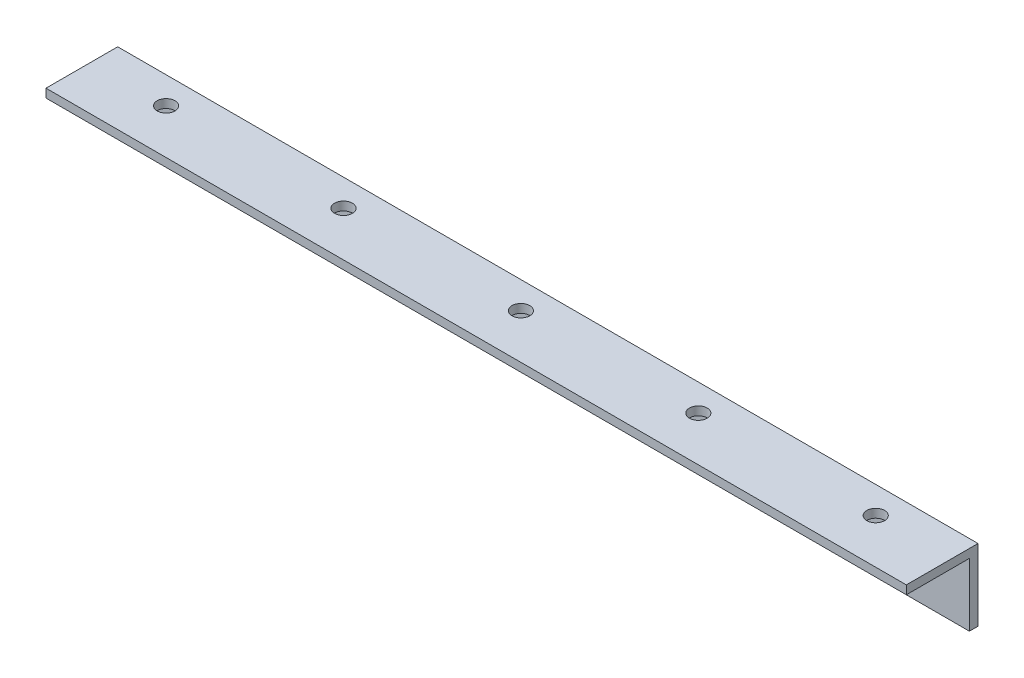
ISO-10303-21;
HEADER;
FILE_DESCRIPTION(('STEP AP214'),'2;1');
FILE_NAME('part.step','',(''),(''),'','','');
FILE_SCHEMA(('AUTOMOTIVE_DESIGN { 1 0 10303 214 1 1 1 1 }'));
ENDSEC;
DATA;
#1=APPLICATION_CONTEXT('core data for automotive mechanical design processes');
#2=APPLICATION_PROTOCOL_DEFINITION('international standard','automotive_design',2000,#1);
#3=PRODUCT_CONTEXT('',#1,'mechanical');
#4=PRODUCT('Part','Part','',(#3));
#5=PRODUCT_RELATED_PRODUCT_CATEGORY('part','',(#4));
#6=PRODUCT_DEFINITION_FORMATION('','',#4);
#7=PRODUCT_DEFINITION_CONTEXT('part definition',#1,'design');
#8=PRODUCT_DEFINITION('design','',#6,#7);
#9=PRODUCT_DEFINITION_SHAPE('','',#8);
#10=(LENGTH_UNIT() NAMED_UNIT(*) SI_UNIT(.MILLI.,.METRE.));
#11=(NAMED_UNIT(*) PLANE_ANGLE_UNIT() SI_UNIT($,.RADIAN.));
#12=(NAMED_UNIT(*) SI_UNIT($,.STERADIAN.) SOLID_ANGLE_UNIT());
#13=UNCERTAINTY_MEASURE_WITH_UNIT(LENGTH_MEASURE(1.E-05),#10,'distance_accuracy_value','');
#14=(GEOMETRIC_REPRESENTATION_CONTEXT(3) GLOBAL_UNCERTAINTY_ASSIGNED_CONTEXT((#13)) GLOBAL_UNIT_ASSIGNED_CONTEXT((#10,
#11,#12)) REPRESENTATION_CONTEXT('',''));
#15=CARTESIAN_POINT('',(0.,0.,0.));
#16=DIRECTION('',(0.,0.,1.));
#17=DIRECTION('',(1.,0.,0.));
#18=AXIS2_PLACEMENT_3D('',#15,#16,#17);
#19=CARTESIAN_POINT('',(-150.,42.,-225.));
#20=DIRECTION('',(1.,0.,0.));
#21=DIRECTION('',(0.,0.,-1.));
#22=AXIS2_PLACEMENT_3D('',#19,#20,#21);
#23=PLANE('',#22);
#24=DIRECTION('',(0.,0.,-1.));
#25=VECTOR('',#24,1.);
#26=CARTESIAN_POINT('',(-150.,45.,-225.));
#27=LINE('',#26,#25);
#28=CARTESIAN_POINT('',(-150.,45.,-195.));
#29=VERTEX_POINT('',#28);
#30=CARTESIAN_POINT('',(-150.,45.,-220.));
#31=VERTEX_POINT('',#30);
#32=EDGE_CURVE('E99',#29,#31,#27,.T.);
#33=ORIENTED_EDGE('',*,*,#32,.T.);
#34=DIRECTION('',(0.,-1.,0.));
#35=VECTOR('',#34,1.);
#36=CARTESIAN_POINT('',(-150.,50.,-220.));
#37=LINE('',#36,#35);
#38=CARTESIAN_POINT('',(-150.,20.,-220.));
#39=VERTEX_POINT('',#38);
#40=EDGE_CURVE('E102',#31,#39,#37,.T.);
#41=ORIENTED_EDGE('',*,*,#40,.T.);
#42=DIRECTION('',(0.,0.,-1.));
#43=VECTOR('',#42,1.);
#44=CARTESIAN_POINT('',(-150.,20.,-217.));
#45=LINE('',#44,#43);
#46=CARTESIAN_POINT('',(-150.,20.,-217.));
#47=VERTEX_POINT('',#46);
#48=EDGE_CURVE('E138',#47,#39,#45,.T.);
#49=ORIENTED_EDGE('',*,*,#48,.F.);
#50=DIRECTION('',(0.,-1.,0.));
#51=VECTOR('',#50,1.);
#52=CARTESIAN_POINT('',(-150.,50.,-217.));
#53=LINE('',#52,#51);
#54=CARTESIAN_POINT('',(-150.,42.,-217.));
#55=VERTEX_POINT('',#54);
#56=EDGE_CURVE('E133',#55,#47,#53,.T.);
#57=ORIENTED_EDGE('',*,*,#56,.F.);
#58=DIRECTION('',(0.,0.,-1.));
#59=VECTOR('',#58,1.);
#60=CARTESIAN_POINT('',(-150.,42.,-225.));
#61=LINE('',#60,#59);
#62=CARTESIAN_POINT('',(-150.,42.,-195.));
#63=VERTEX_POINT('',#62);
#64=EDGE_CURVE('E67',#63,#55,#61,.T.);
#65=ORIENTED_EDGE('',*,*,#64,.F.);
#66=DIRECTION('',(0.,1.,0.));
#67=VECTOR('',#66,1.);
#68=CARTESIAN_POINT('',(-150.,42.,-195.));
#69=LINE('',#68,#67);
#70=EDGE_CURVE('E105',#63,#29,#69,.T.);
#71=ORIENTED_EDGE('',*,*,#70,.T.);
#72=EDGE_LOOP('',(#33,#41,#49,#57,#65,#71));
#73=FACE_BOUND('',#72,.T.);
#74=ADVANCED_FACE('F45',(#73),#23,.F.);
#75=CARTESIAN_POINT('',(150.,42.,-225.));
#76=DIRECTION('',(-1.,0.,0.));
#77=DIRECTION('',(0.,0.,1.));
#78=AXIS2_PLACEMENT_3D('',#75,#76,#77);
#79=PLANE('',#78);
#80=DIRECTION('',(0.,1.,0.));
#81=VECTOR('',#80,1.);
#82=CARTESIAN_POINT('',(150.,50.,-220.));
#83=LINE('',#82,#81);
#84=CARTESIAN_POINT('',(150.,20.,-220.));
#85=VERTEX_POINT('',#84);
#86=CARTESIAN_POINT('',(150.,45.,-220.));
#87=VERTEX_POINT('',#86);
#88=EDGE_CURVE('E122',#85,#87,#83,.T.);
#89=ORIENTED_EDGE('',*,*,#88,.T.);
#90=DIRECTION('',(0.,0.,1.));
#91=VECTOR('',#90,1.);
#92=CARTESIAN_POINT('',(150.,45.,-225.));
#93=LINE('',#92,#91);
#94=CARTESIAN_POINT('',(150.,45.,-195.));
#95=VERTEX_POINT('',#94);
#96=EDGE_CURVE('E59',#87,#95,#93,.T.);
#97=ORIENTED_EDGE('',*,*,#96,.T.);
#98=DIRECTION('',(0.,1.,0.));
#99=VECTOR('',#98,1.);
#100=CARTESIAN_POINT('',(150.,42.,-195.));
#101=LINE('',#100,#99);
#102=CARTESIAN_POINT('',(150.,42.,-195.));
#103=VERTEX_POINT('',#102);
#104=EDGE_CURVE('E53',#103,#95,#101,.T.);
#105=ORIENTED_EDGE('',*,*,#104,.F.);
#106=DIRECTION('',(0.,0.,1.));
#107=VECTOR('',#106,1.);
#108=CARTESIAN_POINT('',(150.,42.,-225.));
#109=LINE('',#108,#107);
#110=CARTESIAN_POINT('',(150.,42.,-217.));
#111=VERTEX_POINT('',#110);
#112=EDGE_CURVE('E185',#111,#103,#109,.T.);
#113=ORIENTED_EDGE('',*,*,#112,.F.);
#114=DIRECTION('',(0.,1.,0.));
#115=VECTOR('',#114,1.);
#116=CARTESIAN_POINT('',(150.,50.,-217.));
#117=LINE('',#116,#115);
#118=CARTESIAN_POINT('',(150.,20.,-217.));
#119=VERTEX_POINT('',#118);
#120=EDGE_CURVE('E128',#119,#111,#117,.T.);
#121=ORIENTED_EDGE('',*,*,#120,.F.);
#122=DIRECTION('',(0.,0.,-1.));
#123=VECTOR('',#122,1.);
#124=CARTESIAN_POINT('',(150.,20.,-217.));
#125=LINE('',#124,#123);
#126=EDGE_CURVE('E134',#119,#85,#125,.T.);
#127=ORIENTED_EDGE('',*,*,#126,.T.);
#128=EDGE_LOOP('',(#89,#97,#105,#113,#121,#127));
#129=FACE_BOUND('',#128,.T.);
#130=ADVANCED_FACE('F204',(#129),#79,.F.);
#131=CARTESIAN_POINT('',(0.,0.,-220.));
#132=DIRECTION('',(0.,0.,1.));
#133=DIRECTION('',(1.,0.,0.));
#134=AXIS2_PLACEMENT_3D('',#131,#132,#133);
#135=PLANE('',#134);
#136=CARTESIAN_POINT('',(-123.733333333333,35.6000000000007,-220.));
#137=DIRECTION('',(0.,0.,1.));
#138=DIRECTION('',(1.,0.,0.));
#139=AXIS2_PLACEMENT_3D('',#136,#137,#138);
#140=CIRCLE('',#139,3.09999999999999);
#141=CARTESIAN_POINT('',(-120.633333333333,35.6000000000007,-220.));
#142=VERTEX_POINT('',#141);
#143=EDGE_CURVE('E246',#142,#142,#140,.T.);
#144=ORIENTED_EDGE('',*,*,#143,.T.);
#145=EDGE_LOOP('',(#144));
#146=FACE_BOUND('',#145,.T.);
#147=CARTESIAN_POINT('',(-61.8666666666666,35.6000000000015,-220.));
#148=DIRECTION('',(0.,0.,1.));
#149=DIRECTION('',(1.,0.,0.));
#150=AXIS2_PLACEMENT_3D('',#147,#148,#149);
#151=CIRCLE('',#150,3.09999999999999);
#152=CARTESIAN_POINT('',(-58.7666666666666,35.6000000000015,-220.));
#153=VERTEX_POINT('',#152);
#154=EDGE_CURVE('E238',#153,#153,#151,.T.);
#155=ORIENTED_EDGE('',*,*,#154,.T.);
#156=EDGE_LOOP('',(#155));
#157=FACE_BOUND('',#156,.T.);
#158=CARTESIAN_POINT('',(0.,35.6000000000026,-220.));
#159=DIRECTION('',(0.,0.,1.));
#160=DIRECTION('',(1.,0.,0.));
#161=AXIS2_PLACEMENT_3D('',#158,#159,#160);
#162=CIRCLE('',#161,3.09999999999999);
#163=CARTESIAN_POINT('',(3.09999999999999,35.6000000000026,-220.));
#164=VERTEX_POINT('',#163);
#165=EDGE_CURVE('E230',#164,#164,#162,.T.);
#166=ORIENTED_EDGE('',*,*,#165,.T.);
#167=EDGE_LOOP('',(#166));
#168=FACE_BOUND('',#167,.T.);
#169=CARTESIAN_POINT('',(61.8666666666666,35.6000000000033,-220.));
#170=DIRECTION('',(0.,0.,1.));
#171=DIRECTION('',(1.,0.,0.));
#172=AXIS2_PLACEMENT_3D('',#169,#170,#171);
#173=CIRCLE('',#172,3.09999999999999);
#174=CARTESIAN_POINT('',(64.9666666666666,35.6000000000033,-220.));
#175=VERTEX_POINT('',#174);
#176=EDGE_CURVE('E222',#175,#175,#173,.T.);
#177=ORIENTED_EDGE('',*,*,#176,.T.);
#178=EDGE_LOOP('',(#177));
#179=FACE_BOUND('',#178,.T.);
#180=CARTESIAN_POINT('',(123.733333333333,35.6000000000041,-220.));
#181=DIRECTION('',(0.,0.,1.));
#182=DIRECTION('',(1.,0.,0.));
#183=AXIS2_PLACEMENT_3D('',#180,#181,#182);
#184=CIRCLE('',#183,3.09999999999999);
#185=CARTESIAN_POINT('',(126.833333333333,35.6000000000041,-220.));
#186=VERTEX_POINT('',#185);
#187=EDGE_CURVE('E125',#186,#186,#184,.T.);
#188=ORIENTED_EDGE('',*,*,#187,.T.);
#189=EDGE_LOOP('',(#188));
#190=FACE_BOUND('',#189,.T.);
#191=DIRECTION('',(-1.,0.,0.));
#192=VECTOR('',#191,1.);
#193=CARTESIAN_POINT('',(0.,45.,-220.));
#194=LINE('',#193,#192);
#195=EDGE_CURVE('E11',#87,#31,#194,.T.);
#196=ORIENTED_EDGE('',*,*,#195,.F.);
#197=ORIENTED_EDGE('',*,*,#88,.F.);
#198=DIRECTION('',(1.,0.,0.));
#199=VECTOR('',#198,1.);
#200=CARTESIAN_POINT('',(-150.,20.,-220.));
#201=LINE('',#200,#199);
#202=EDGE_CURVE('E115',#39,#85,#201,.T.);
#203=ORIENTED_EDGE('',*,*,#202,.F.);
#204=ORIENTED_EDGE('',*,*,#40,.F.);
#205=EDGE_LOOP('',(#196,#197,#203,#204));
#206=FACE_BOUND('',#205,.T.);
#207=ADVANCED_FACE('F114',(#146,#157,#168,#179,#190,#206),#135,.F.);
#208=CARTESIAN_POINT('',(0.,42.,0.));
#209=DIRECTION('',(0.,1.,0.));
#210=DIRECTION('',(0.,0.,1.));
#211=AXIS2_PLACEMENT_3D('',#208,#209,#210);
#212=PLANE('',#211);
#213=ORIENTED_EDGE('',*,*,#64,.T.);
#214=DIRECTION('',(1.,0.,0.));
#215=VECTOR('',#214,1.);
#216=CARTESIAN_POINT('',(0.,42.,-217.));
#217=LINE('',#216,#215);
#218=EDGE_CURVE('E141',#55,#111,#217,.T.);
#219=ORIENTED_EDGE('',*,*,#218,.T.);
#220=ORIENTED_EDGE('',*,*,#112,.T.);
#221=DIRECTION('',(-1.,0.,0.));
#222=VECTOR('',#221,1.);
#223=CARTESIAN_POINT('',(-150.,42.,-195.));
#224=LINE('',#223,#222);
#225=EDGE_CURVE('E189',#103,#63,#224,.T.);
#226=ORIENTED_EDGE('',*,*,#225,.T.);
#227=EDGE_LOOP('',(#213,#219,#220,#226));
#228=FACE_BOUND('',#227,.T.);
#229=CARTESIAN_POINT('',(123.733333333333,42.,-210.6));
#230=DIRECTION('',(0.,-1.,0.));
#231=DIRECTION('',(0.,0.,-1.));
#232=AXIS2_PLACEMENT_3D('',#229,#230,#231);
#233=CIRCLE('',#232,3.09999999999999);
#234=CARTESIAN_POINT('',(123.733333333333,42.,-213.7));
#235=VERTEX_POINT('',#234);
#236=EDGE_CURVE('E107',#235,#235,#233,.T.);
#237=ORIENTED_EDGE('',*,*,#236,.F.);
#238=EDGE_LOOP('',(#237));
#239=FACE_BOUND('',#238,.T.);
#240=CARTESIAN_POINT('',(61.8666666666667,42.,-210.6));
#241=DIRECTION('',(0.,-1.,0.));
#242=DIRECTION('',(0.,0.,-1.));
#243=AXIS2_PLACEMENT_3D('',#240,#241,#242);
#244=CIRCLE('',#243,3.09999999999999);
#245=CARTESIAN_POINT('',(61.8666666666667,42.,-213.7));
#246=VERTEX_POINT('',#245);
#247=EDGE_CURVE('E169',#246,#246,#244,.T.);
#248=ORIENTED_EDGE('',*,*,#247,.F.);
#249=EDGE_LOOP('',(#248));
#250=FACE_BOUND('',#249,.T.);
#251=CARTESIAN_POINT('',(0.,42.,-210.6));
#252=DIRECTION('',(0.,-1.,0.));
#253=DIRECTION('',(0.,0.,-1.));
#254=AXIS2_PLACEMENT_3D('',#251,#252,#253);
#255=CIRCLE('',#254,3.09999999999998);
#256=CARTESIAN_POINT('',(0.,42.,-213.7));
#257=VERTEX_POINT('',#256);
#258=EDGE_CURVE('E161',#257,#257,#255,.T.);
#259=ORIENTED_EDGE('',*,*,#258,.F.);
#260=EDGE_LOOP('',(#259));
#261=FACE_BOUND('',#260,.T.);
#262=CARTESIAN_POINT('',(-61.8666666666667,42.,-210.6));
#263=DIRECTION('',(0.,-1.,0.));
#264=DIRECTION('',(0.,0.,-1.));
#265=AXIS2_PLACEMENT_3D('',#262,#263,#264);
#266=CIRCLE('',#265,3.09999999999999);
#267=CARTESIAN_POINT('',(-61.8666666666667,42.,-213.7));
#268=VERTEX_POINT('',#267);
#269=EDGE_CURVE('E153',#268,#268,#266,.T.);
#270=ORIENTED_EDGE('',*,*,#269,.F.);
#271=EDGE_LOOP('',(#270));
#272=FACE_BOUND('',#271,.T.);
#273=CARTESIAN_POINT('',(-123.733333333333,42.,-210.6));
#274=DIRECTION('',(0.,-1.,0.));
#275=DIRECTION('',(0.,0.,-1.));
#276=AXIS2_PLACEMENT_3D('',#273,#274,#275);
#277=CIRCLE('',#276,3.09999999999999);
#278=CARTESIAN_POINT('',(-123.733333333333,42.,-213.7));
#279=VERTEX_POINT('',#278);
#280=EDGE_CURVE('E145',#279,#279,#277,.T.);
#281=ORIENTED_EDGE('',*,*,#280,.F.);
#282=EDGE_LOOP('',(#281));
#283=FACE_BOUND('',#282,.T.);
#284=ADVANCED_FACE('F262',(#228,#239,#250,#261,#272,#283),#212,.F.);
#285=CARTESIAN_POINT('',(0.,45.,0.));
#286=DIRECTION('',(0.,1.,0.));
#287=DIRECTION('',(0.,0.,1.));
#288=AXIS2_PLACEMENT_3D('',#285,#286,#287);
#289=PLANE('',#288);
#290=ORIENTED_EDGE('',*,*,#96,.F.);
#291=ORIENTED_EDGE('',*,*,#195,.T.);
#292=ORIENTED_EDGE('',*,*,#32,.F.);
#293=DIRECTION('',(-1.,0.,0.));
#294=VECTOR('',#293,1.);
#295=CARTESIAN_POINT('',(-150.,45.,-195.));
#296=LINE('',#295,#294);
#297=EDGE_CURVE('E186',#95,#29,#296,.T.);
#298=ORIENTED_EDGE('',*,*,#297,.F.);
#299=EDGE_LOOP('',(#290,#291,#292,#298));
#300=FACE_BOUND('',#299,.T.);
#301=CARTESIAN_POINT('',(-61.8666666666667,45.,-210.6));
#302=DIRECTION('',(0.,-1.,0.));
#303=DIRECTION('',(0.,0.,-1.));
#304=AXIS2_PLACEMENT_3D('',#301,#302,#303);
#305=CIRCLE('',#304,3.09999999999999);
#306=CARTESIAN_POINT('',(-61.8666666666667,45.,-213.7));
#307=VERTEX_POINT('',#306);
#308=EDGE_CURVE('E149',#307,#307,#305,.T.);
#309=ORIENTED_EDGE('',*,*,#308,.T.);
#310=EDGE_LOOP('',(#309));
#311=FACE_BOUND('',#310,.T.);
#312=CARTESIAN_POINT('',(61.8666666666667,45.,-210.6));
#313=DIRECTION('',(0.,-1.,0.));
#314=DIRECTION('',(0.,0.,-1.));
#315=AXIS2_PLACEMENT_3D('',#312,#313,#314);
#316=CIRCLE('',#315,3.09999999999999);
#317=CARTESIAN_POINT('',(61.8666666666667,45.,-213.7));
#318=VERTEX_POINT('',#317);
#319=EDGE_CURVE('E165',#318,#318,#316,.T.);
#320=ORIENTED_EDGE('',*,*,#319,.T.);
#321=EDGE_LOOP('',(#320));
#322=FACE_BOUND('',#321,.T.);
#323=CARTESIAN_POINT('',(123.733333333333,45.,-210.6));
#324=DIRECTION('',(0.,-1.,0.));
#325=DIRECTION('',(0.,0.,-1.));
#326=AXIS2_PLACEMENT_3D('',#323,#324,#325);
#327=CIRCLE('',#326,3.09999999999999);
#328=CARTESIAN_POINT('',(123.733333333333,45.,-213.7));
#329=VERTEX_POINT('',#328);
#330=EDGE_CURVE('E173',#329,#329,#327,.T.);
#331=ORIENTED_EDGE('',*,*,#330,.T.);
#332=EDGE_LOOP('',(#331));
#333=FACE_BOUND('',#332,.T.);
#334=CARTESIAN_POINT('',(0.,45.,-210.6));
#335=DIRECTION('',(0.,-1.,0.));
#336=DIRECTION('',(0.,0.,-1.));
#337=AXIS2_PLACEMENT_3D('',#334,#335,#336);
#338=CIRCLE('',#337,3.09999999999998);
#339=CARTESIAN_POINT('',(0.,45.,-213.7));
#340=VERTEX_POINT('',#339);
#341=EDGE_CURVE('E157',#340,#340,#338,.T.);
#342=ORIENTED_EDGE('',*,*,#341,.T.);
#343=EDGE_LOOP('',(#342));
#344=FACE_BOUND('',#343,.T.);
#345=CARTESIAN_POINT('',(-123.733333333333,45.,-210.6));
#346=DIRECTION('',(0.,-1.,0.));
#347=DIRECTION('',(0.,0.,-1.));
#348=AXIS2_PLACEMENT_3D('',#345,#346,#347);
#349=CIRCLE('',#348,3.09999999999999);
#350=CARTESIAN_POINT('',(-123.733333333333,45.,-213.7));
#351=VERTEX_POINT('',#350);
#352=EDGE_CURVE('E144',#351,#351,#349,.T.);
#353=ORIENTED_EDGE('',*,*,#352,.T.);
#354=EDGE_LOOP('',(#353));
#355=FACE_BOUND('',#354,.T.);
#356=ADVANCED_FACE('F109',(#300,#311,#322,#333,#344,#355),#289,.T.);
#357=CARTESIAN_POINT('',(-150.,42.,-195.));
#358=DIRECTION('',(0.,0.,-1.));
#359=DIRECTION('',(-1.,0.,0.));
#360=AXIS2_PLACEMENT_3D('',#357,#358,#359);
#361=PLANE('',#360);
#362=ORIENTED_EDGE('',*,*,#297,.T.);
#363=ORIENTED_EDGE('',*,*,#70,.F.);
#364=ORIENTED_EDGE('',*,*,#225,.F.);
#365=ORIENTED_EDGE('',*,*,#104,.T.);
#366=EDGE_LOOP('',(#362,#363,#364,#365));
#367=FACE_BOUND('',#366,.T.);
#368=ADVANCED_FACE('F202',(#367),#361,.F.);
#369=CARTESIAN_POINT('',(123.733333333333,42.,-210.6));
#370=DIRECTION('',(0.,1.,0.));
#371=DIRECTION('',(0.,0.,1.));
#372=AXIS2_PLACEMENT_3D('',#369,#370,#371);
#373=CYLINDRICAL_SURFACE('',#372,3.09999999999999);
#374=ORIENTED_EDGE('',*,*,#236,.T.);
#375=EDGE_LOOP('',(#374));
#376=FACE_BOUND('',#375,.T.);
#377=ORIENTED_EDGE('',*,*,#330,.F.);
#378=EDGE_LOOP('',(#377));
#379=FACE_BOUND('',#378,.T.);
#380=ADVANCED_FACE('F288',(#376,#379),#373,.F.);
#381=CARTESIAN_POINT('',(61.8666666666667,42.,-210.6));
#382=DIRECTION('',(0.,1.,0.));
#383=DIRECTION('',(0.,0.,1.));
#384=AXIS2_PLACEMENT_3D('',#381,#382,#383);
#385=CYLINDRICAL_SURFACE('',#384,3.09999999999999);
#386=ORIENTED_EDGE('',*,*,#247,.T.);
#387=EDGE_LOOP('',(#386));
#388=FACE_BOUND('',#387,.T.);
#389=ORIENTED_EDGE('',*,*,#319,.F.);
#390=EDGE_LOOP('',(#389));
#391=FACE_BOUND('',#390,.T.);
#392=ADVANCED_FACE('F313',(#388,#391),#385,.F.);
#393=CARTESIAN_POINT('',(0.,42.,-210.6));
#394=DIRECTION('',(0.,1.,0.));
#395=DIRECTION('',(0.,0.,1.));
#396=AXIS2_PLACEMENT_3D('',#393,#394,#395);
#397=CYLINDRICAL_SURFACE('',#396,3.09999999999998);
#398=ORIENTED_EDGE('',*,*,#258,.T.);
#399=EDGE_LOOP('',(#398));
#400=FACE_BOUND('',#399,.T.);
#401=ORIENTED_EDGE('',*,*,#341,.F.);
#402=EDGE_LOOP('',(#401));
#403=FACE_BOUND('',#402,.T.);
#404=ADVANCED_FACE('F309',(#400,#403),#397,.F.);
#405=CARTESIAN_POINT('',(-61.8666666666667,42.,-210.6));
#406=DIRECTION('',(0.,1.,0.));
#407=DIRECTION('',(0.,0.,1.));
#408=AXIS2_PLACEMENT_3D('',#405,#406,#407);
#409=CYLINDRICAL_SURFACE('',#408,3.09999999999999);
#410=ORIENTED_EDGE('',*,*,#269,.T.);
#411=EDGE_LOOP('',(#410));
#412=FACE_BOUND('',#411,.T.);
#413=ORIENTED_EDGE('',*,*,#308,.F.);
#414=EDGE_LOOP('',(#413));
#415=FACE_BOUND('',#414,.T.);
#416=ADVANCED_FACE('F278',(#412,#415),#409,.F.);
#417=CARTESIAN_POINT('',(-123.733333333333,42.,-210.6));
#418=DIRECTION('',(0.,1.,0.));
#419=DIRECTION('',(0.,0.,1.));
#420=AXIS2_PLACEMENT_3D('',#417,#418,#419);
#421=CYLINDRICAL_SURFACE('',#420,3.09999999999999);
#422=ORIENTED_EDGE('',*,*,#280,.T.);
#423=EDGE_LOOP('',(#422));
#424=FACE_BOUND('',#423,.T.);
#425=ORIENTED_EDGE('',*,*,#352,.F.);
#426=EDGE_LOOP('',(#425));
#427=FACE_BOUND('',#426,.T.);
#428=ADVANCED_FACE('F259',(#424,#427),#421,.F.);
#429=CARTESIAN_POINT('',(0.,0.,-217.));
#430=DIRECTION('',(0.,0.,1.));
#431=DIRECTION('',(1.,0.,0.));
#432=AXIS2_PLACEMENT_3D('',#429,#430,#431);
#433=PLANE('',#432);
#434=CARTESIAN_POINT('',(-61.8666666666666,35.6000000000015,-217.));
#435=DIRECTION('',(0.,0.,1.));
#436=DIRECTION('',(1.,0.,0.));
#437=AXIS2_PLACEMENT_3D('',#434,#435,#436);
#438=CIRCLE('',#437,3.09999999999999);
#439=CARTESIAN_POINT('',(-58.7666666666666,35.6000000000015,-217.));
#440=VERTEX_POINT('',#439);
#441=EDGE_CURVE('E234',#440,#440,#438,.T.);
#442=ORIENTED_EDGE('',*,*,#441,.F.);
#443=EDGE_LOOP('',(#442));
#444=FACE_BOUND('',#443,.T.);
#445=CARTESIAN_POINT('',(61.8666666666666,35.6000000000033,-217.));
#446=DIRECTION('',(0.,0.,1.));
#447=DIRECTION('',(1.,0.,0.));
#448=AXIS2_PLACEMENT_3D('',#445,#446,#447);
#449=CIRCLE('',#448,3.09999999999999);
#450=CARTESIAN_POINT('',(64.9666666666666,35.6000000000033,-217.));
#451=VERTEX_POINT('',#450);
#452=EDGE_CURVE('E220',#451,#451,#449,.T.);
#453=ORIENTED_EDGE('',*,*,#452,.F.);
#454=EDGE_LOOP('',(#453));
#455=FACE_BOUND('',#454,.T.);
#456=CARTESIAN_POINT('',(123.733333333333,35.6000000000041,-217.));
#457=DIRECTION('',(0.,0.,1.));
#458=DIRECTION('',(1.,0.,0.));
#459=AXIS2_PLACEMENT_3D('',#456,#457,#458);
#460=CIRCLE('',#459,3.09999999999999);
#461=CARTESIAN_POINT('',(126.833333333333,35.6000000000041,-217.));
#462=VERTEX_POINT('',#461);
#463=EDGE_CURVE('E118',#462,#462,#460,.T.);
#464=ORIENTED_EDGE('',*,*,#463,.F.);
#465=EDGE_LOOP('',(#464));
#466=FACE_BOUND('',#465,.T.);
#467=CARTESIAN_POINT('',(0.,35.6000000000026,-217.));
#468=DIRECTION('',(0.,0.,1.));
#469=DIRECTION('',(1.,0.,0.));
#470=AXIS2_PLACEMENT_3D('',#467,#468,#469);
#471=CIRCLE('',#470,3.09999999999999);
#472=CARTESIAN_POINT('',(3.09999999999999,35.6000000000026,-217.));
#473=VERTEX_POINT('',#472);
#474=EDGE_CURVE('E226',#473,#473,#471,.T.);
#475=ORIENTED_EDGE('',*,*,#474,.F.);
#476=EDGE_LOOP('',(#475));
#477=FACE_BOUND('',#476,.T.);
#478=CARTESIAN_POINT('',(-123.733333333333,35.6000000000007,-217.));
#479=DIRECTION('',(0.,0.,1.));
#480=DIRECTION('',(1.,0.,0.));
#481=AXIS2_PLACEMENT_3D('',#478,#479,#480);
#482=CIRCLE('',#481,3.09999999999999);
#483=CARTESIAN_POINT('',(-120.633333333333,35.6000000000007,-217.));
#484=VERTEX_POINT('',#483);
#485=EDGE_CURVE('E242',#484,#484,#482,.T.);
#486=ORIENTED_EDGE('',*,*,#485,.F.);
#487=EDGE_LOOP('',(#486));
#488=FACE_BOUND('',#487,.T.);
#489=ORIENTED_EDGE('',*,*,#218,.F.);
#490=ORIENTED_EDGE('',*,*,#56,.T.);
#491=DIRECTION('',(1.,0.,0.));
#492=VECTOR('',#491,1.);
#493=CARTESIAN_POINT('',(-150.,20.,-217.));
#494=LINE('',#493,#492);
#495=EDGE_CURVE('E211',#47,#119,#494,.T.);
#496=ORIENTED_EDGE('',*,*,#495,.T.);
#497=ORIENTED_EDGE('',*,*,#120,.T.);
#498=EDGE_LOOP('',(#489,#490,#496,#497));
#499=FACE_BOUND('',#498,.T.);
#500=ADVANCED_FACE('F257',(#444,#455,#466,#477,#488,#499),#433,.T.);
#501=CARTESIAN_POINT('',(-150.,20.,-217.));
#502=DIRECTION('',(0.,1.,0.));
#503=DIRECTION('',(-1.,0.,0.));
#504=AXIS2_PLACEMENT_3D('',#501,#502,#503);
#505=PLANE('',#504);
#506=ORIENTED_EDGE('',*,*,#202,.T.);
#507=ORIENTED_EDGE('',*,*,#126,.F.);
#508=ORIENTED_EDGE('',*,*,#495,.F.);
#509=ORIENTED_EDGE('',*,*,#48,.T.);
#510=EDGE_LOOP('',(#506,#507,#508,#509));
#511=FACE_BOUND('',#510,.T.);
#512=ADVANCED_FACE('F210',(#511),#505,.F.);
#513=CARTESIAN_POINT('',(123.733333333333,35.6000000000041,-217.));
#514=DIRECTION('',(0.,0.,-1.));
#515=DIRECTION('',(-1.,0.,0.));
#516=AXIS2_PLACEMENT_3D('',#513,#514,#515);
#517=CYLINDRICAL_SURFACE('',#516,3.09999999999999);
#518=ORIENTED_EDGE('',*,*,#463,.T.);
#519=EDGE_LOOP('',(#518));
#520=FACE_BOUND('',#519,.T.);
#521=ORIENTED_EDGE('',*,*,#187,.F.);
#522=EDGE_LOOP('',(#521));
#523=FACE_BOUND('',#522,.T.);
#524=ADVANCED_FACE('F305',(#520,#523),#517,.F.);
#525=CARTESIAN_POINT('',(61.8666666666666,35.6000000000033,-217.));
#526=DIRECTION('',(0.,0.,-1.));
#527=DIRECTION('',(-1.,0.,0.));
#528=AXIS2_PLACEMENT_3D('',#525,#526,#527);
#529=CYLINDRICAL_SURFACE('',#528,3.09999999999999);
#530=ORIENTED_EDGE('',*,*,#452,.T.);
#531=EDGE_LOOP('',(#530));
#532=FACE_BOUND('',#531,.T.);
#533=ORIENTED_EDGE('',*,*,#176,.F.);
#534=EDGE_LOOP('',(#533));
#535=FACE_BOUND('',#534,.T.);
#536=ADVANCED_FACE('F373',(#532,#535),#529,.F.);
#537=CARTESIAN_POINT('',(0.,35.6000000000026,-217.));
#538=DIRECTION('',(0.,0.,-1.));
#539=DIRECTION('',(-1.,0.,0.));
#540=AXIS2_PLACEMENT_3D('',#537,#538,#539);
#541=CYLINDRICAL_SURFACE('',#540,3.09999999999999);
#542=ORIENTED_EDGE('',*,*,#474,.T.);
#543=EDGE_LOOP('',(#542));
#544=FACE_BOUND('',#543,.T.);
#545=ORIENTED_EDGE('',*,*,#165,.F.);
#546=EDGE_LOOP('',(#545));
#547=FACE_BOUND('',#546,.T.);
#548=ADVANCED_FACE('F381',(#544,#547),#541,.F.);
#549=CARTESIAN_POINT('',(-61.8666666666666,35.6000000000015,-217.));
#550=DIRECTION('',(0.,0.,-1.));
#551=DIRECTION('',(-1.,0.,0.));
#552=AXIS2_PLACEMENT_3D('',#549,#550,#551);
#553=CYLINDRICAL_SURFACE('',#552,3.09999999999999);
#554=ORIENTED_EDGE('',*,*,#441,.T.);
#555=EDGE_LOOP('',(#554));
#556=FACE_BOUND('',#555,.T.);
#557=ORIENTED_EDGE('',*,*,#154,.F.);
#558=EDGE_LOOP('',(#557));
#559=FACE_BOUND('',#558,.T.);
#560=ADVANCED_FACE('F390',(#556,#559),#553,.F.);
#561=CARTESIAN_POINT('',(-123.733333333333,35.6000000000007,-217.));
#562=DIRECTION('',(0.,0.,-1.));
#563=DIRECTION('',(-1.,0.,0.));
#564=AXIS2_PLACEMENT_3D('',#561,#562,#563);
#565=CYLINDRICAL_SURFACE('',#564,3.09999999999999);
#566=ORIENTED_EDGE('',*,*,#485,.T.);
#567=EDGE_LOOP('',(#566));
#568=FACE_BOUND('',#567,.T.);
#569=ORIENTED_EDGE('',*,*,#143,.F.);
#570=EDGE_LOOP('',(#569));
#571=FACE_BOUND('',#570,.T.);
#572=ADVANCED_FACE('F254',(#568,#571),#565,.F.);
#573=CLOSED_SHELL('',(#74,#130,#207,#284,#356,#368,#380,#392,#404,#416,#428,#500,#512,#524,#536,
#548,#560,#572));
#574=MANIFOLD_SOLID_BREP('B2',#573);
#575=ADVANCED_BREP_SHAPE_REPRESENTATION('',(#18,#574),#14);
#576=SHAPE_DEFINITION_REPRESENTATION(#9,#575);
ENDSEC;
END-ISO-10303-21;
